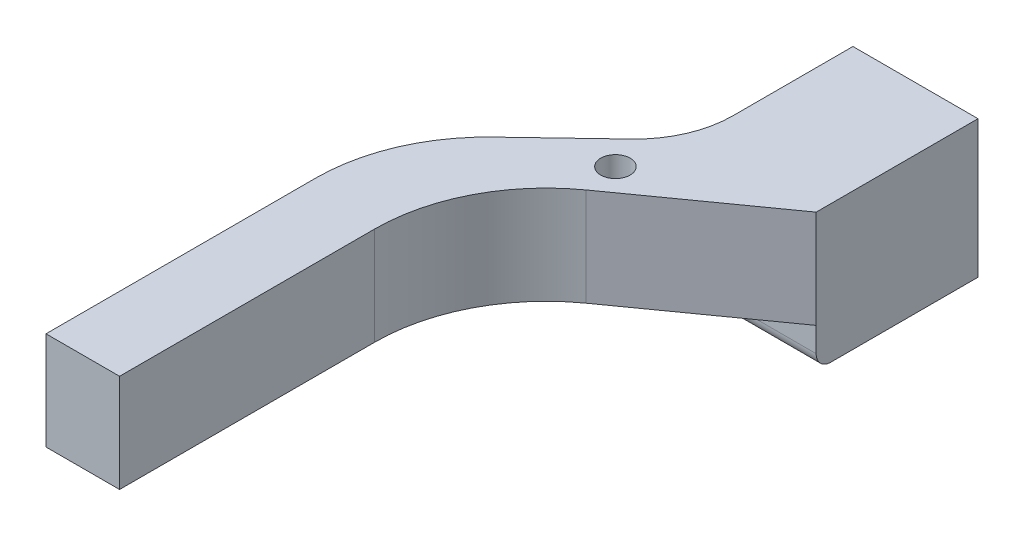
ISO-10303-21;
HEADER;
FILE_DESCRIPTION(('STEP AP214'),'2;1');
FILE_NAME('part.step','',(''),(''),'','','');
FILE_SCHEMA(('AUTOMOTIVE_DESIGN { 1 0 10303 214 1 1 1 1 }'));
ENDSEC;
DATA;
#1=APPLICATION_CONTEXT('core data for automotive mechanical design processes');
#2=APPLICATION_PROTOCOL_DEFINITION('international standard','automotive_design',2000,#1);
#3=PRODUCT_CONTEXT('',#1,'mechanical');
#4=PRODUCT('Part','Part','',(#3));
#5=PRODUCT_RELATED_PRODUCT_CATEGORY('part','',(#4));
#6=PRODUCT_DEFINITION_FORMATION('','',#4);
#7=PRODUCT_DEFINITION_CONTEXT('part definition',#1,'design');
#8=PRODUCT_DEFINITION('design','',#6,#7);
#9=PRODUCT_DEFINITION_SHAPE('','',#8);
#10=(LENGTH_UNIT() NAMED_UNIT(*) SI_UNIT(.MILLI.,.METRE.));
#11=(NAMED_UNIT(*) PLANE_ANGLE_UNIT() SI_UNIT($,.RADIAN.));
#12=(NAMED_UNIT(*) SI_UNIT($,.STERADIAN.) SOLID_ANGLE_UNIT());
#13=UNCERTAINTY_MEASURE_WITH_UNIT(LENGTH_MEASURE(1.E-05),#10,'distance_accuracy_value','');
#14=(GEOMETRIC_REPRESENTATION_CONTEXT(3) GLOBAL_UNCERTAINTY_ASSIGNED_CONTEXT((#13)) GLOBAL_UNIT_ASSIGNED_CONTEXT((#10,
#11,#12)) REPRESENTATION_CONTEXT('',''));
#15=CARTESIAN_POINT('',(0.,0.,0.));
#16=DIRECTION('',(0.,0.,1.));
#17=DIRECTION('',(1.,0.,0.));
#18=AXIS2_PLACEMENT_3D('',#15,#16,#17);
#19=CARTESIAN_POINT('',(81.5691059886915,0.,0.));
#20=DIRECTION('',(0.,0.,-1.));
#21=DIRECTION('',(1.,0.,0.));
#22=AXIS2_PLACEMENT_3D('',#19,#20,#21);
#23=PLANE('',#22);
#24=DIRECTION('',(0.,1.,0.));
#25=VECTOR('',#24,1.);
#26=CARTESIAN_POINT('',(72.3191059886915,-14.,0.));
#27=LINE('',#26,#25);
#28=CARTESIAN_POINT('',(72.3191059886915,-14.,0.));
#29=VERTEX_POINT('',#28);
#30=CARTESIAN_POINT('',(72.3191059886915,14.,0.));
#31=VERTEX_POINT('',#30);
#32=EDGE_CURVE('E240',#29,#31,#27,.T.);
#33=ORIENTED_EDGE('',*,*,#32,.T.);
#34=DIRECTION('',(1.,0.,0.));
#35=VECTOR('',#34,1.);
#36=CARTESIAN_POINT('',(97.8191059886915,14.,0.));
#37=LINE('',#36,#35);
#38=CARTESIAN_POINT('',(97.8191059886915,14.,0.));
#39=VERTEX_POINT('',#38);
#40=EDGE_CURVE('E243',#31,#39,#37,.T.);
#41=ORIENTED_EDGE('',*,*,#40,.T.);
#42=DIRECTION('',(0.,-1.,0.));
#43=VECTOR('',#42,1.);
#44=CARTESIAN_POINT('',(97.8191059886915,-14.,0.));
#45=LINE('',#44,#43);
#46=CARTESIAN_POINT('',(97.8191059886915,-14.,0.));
#47=VERTEX_POINT('',#46);
#48=EDGE_CURVE('E246',#39,#47,#45,.T.);
#49=ORIENTED_EDGE('',*,*,#48,.T.);
#50=DIRECTION('',(-1.,0.,0.));
#51=VECTOR('',#50,1.);
#52=CARTESIAN_POINT('',(97.8191059886915,-14.,0.));
#53=LINE('',#52,#51);
#54=EDGE_CURVE('E249',#47,#29,#53,.T.);
#55=ORIENTED_EDGE('',*,*,#54,.T.);
#56=EDGE_LOOP('',(#33,#41,#49,#55));
#57=FACE_BOUND('',#56,.T.);
#58=DIRECTION('',(-1.,0.,0.));
#59=VECTOR('',#58,1.);
#60=CARTESIAN_POINT('',(87.8191059886915,-11.3,0.));
#61=LINE('',#60,#59);
#62=CARTESIAN_POINT('',(87.8191059886915,-11.3,0.));
#63=VERTEX_POINT('',#62);
#64=CARTESIAN_POINT('',(75.3191059886915,-11.3,0.));
#65=VERTEX_POINT('',#64);
#66=EDGE_CURVE('E214',#63,#65,#61,.T.);
#67=ORIENTED_EDGE('',*,*,#66,.F.);
#68=DIRECTION('',(0.,-1.,0.));
#69=VECTOR('',#68,1.);
#70=CARTESIAN_POINT('',(87.8191059886915,-11.3,0.));
#71=LINE('',#70,#69);
#72=CARTESIAN_POINT('',(87.8191059886915,11.3,0.));
#73=VERTEX_POINT('',#72);
#74=EDGE_CURVE('E228',#73,#63,#71,.T.);
#75=ORIENTED_EDGE('',*,*,#74,.F.);
#76=DIRECTION('',(1.,0.,0.));
#77=VECTOR('',#76,1.);
#78=CARTESIAN_POINT('',(87.8191059886915,11.3,0.));
#79=LINE('',#78,#77);
#80=CARTESIAN_POINT('',(75.3191059886915,11.3,0.));
#81=VERTEX_POINT('',#80);
#82=EDGE_CURVE('E225',#81,#73,#79,.T.);
#83=ORIENTED_EDGE('',*,*,#82,.F.);
#84=DIRECTION('',(0.,1.,0.));
#85=VECTOR('',#84,1.);
#86=CARTESIAN_POINT('',(75.3191059886915,-11.3,0.));
#87=LINE('',#86,#85);
#88=EDGE_CURVE('E209',#65,#81,#87,.T.);
#89=ORIENTED_EDGE('',*,*,#88,.F.);
#90=EDGE_LOOP('',(#67,#75,#83,#89));
#91=FACE_BOUND('',#90,.T.);
#92=ADVANCED_FACE('F37',(#57,#91),#23,.T.);
#93=CARTESIAN_POINT('',(72.3191059886915,-14.,30.));
#94=DIRECTION('',(1.,0.,0.));
#95=DIRECTION('',(0.,0.,1.));
#96=AXIS2_PLACEMENT_3D('',#93,#94,#95);
#97=PLANE('',#96);
#98=DIRECTION('',(0.,0.,-1.));
#99=VECTOR('',#98,1.);
#100=CARTESIAN_POINT('',(72.3191059886915,14.,30.));
#101=LINE('',#100,#99);
#102=CARTESIAN_POINT('',(72.3191059886915,14.,24.4220901374142));
#103=VERTEX_POINT('',#102);
#104=EDGE_CURVE('E258',#103,#31,#101,.T.);
#105=ORIENTED_EDGE('',*,*,#104,.T.);
#106=ORIENTED_EDGE('',*,*,#32,.F.);
#107=DIRECTION('',(0.,0.,-1.));
#108=VECTOR('',#107,1.);
#109=CARTESIAN_POINT('',(72.3191059886915,-14.,30.));
#110=LINE('',#109,#108);
#111=CARTESIAN_POINT('',(72.3191059886915,-14.,30.));
#112=VERTEX_POINT('',#111);
#113=EDGE_CURVE('E252',#112,#29,#110,.T.);
#114=ORIENTED_EDGE('',*,*,#113,.F.);
#115=CARTESIAN_POINT('',(72.3191059886915,-11.,30.));
#116=DIRECTION('',(-1.,0.,0.));
#117=DIRECTION('',(0.,0.,1.));
#118=AXIS2_PLACEMENT_3D('',#115,#116,#117);
#119=CIRCLE('',#118,3.);
#120=CARTESIAN_POINT('',(72.3191059886915,-11.,33.));
#121=VERTEX_POINT('',#120);
#122=EDGE_CURVE('E262',#121,#112,#119,.F.);
#123=ORIENTED_EDGE('',*,*,#122,.F.);
#124=DIRECTION('',(0.,1.,0.));
#125=VECTOR('',#124,1.);
#126=CARTESIAN_POINT('',(72.3191059886915,14.,33.));
#127=LINE('',#126,#125);
#128=CARTESIAN_POINT('',(72.3191059886915,-6.,33.));
#129=VERTEX_POINT('',#128);
#130=EDGE_CURVE('E201',#121,#129,#127,.T.);
#131=ORIENTED_EDGE('',*,*,#130,.T.);
#132=DIRECTION('',(0.,0.,1.));
#133=VECTOR('',#132,1.);
#134=CARTESIAN_POINT('',(72.3191059886915,-6.,0.));
#135=LINE('',#134,#133);
#136=CARTESIAN_POINT('',(72.3191059886915,-6.,24.4220901374142));
#137=VERTEX_POINT('',#136);
#138=EDGE_CURVE('E290',#137,#129,#135,.T.);
#139=ORIENTED_EDGE('',*,*,#138,.F.);
#140=DIRECTION('',(0.,1.,0.));
#141=VECTOR('',#140,1.);
#142=CARTESIAN_POINT('',(72.3191059886915,-14.,24.4220901374142));
#143=LINE('',#142,#141);
#144=EDGE_CURVE('E292',#103,#137,#143,.F.);
#145=ORIENTED_EDGE('',*,*,#144,.F.);
#146=EDGE_LOOP('',(#105,#106,#114,#123,#131,#139,#145));
#147=FACE_BOUND('',#146,.T.);
#148=ADVANCED_FACE('F298',(#147),#97,.F.);
#149=CARTESIAN_POINT('',(97.8191059886915,14.,30.));
#150=DIRECTION('',(0.,-1.,0.));
#151=DIRECTION('',(0.,0.,-1.));
#152=AXIS2_PLACEMENT_3D('',#149,#150,#151);
#153=PLANE('',#152);
#154=CARTESIAN_POINT('',(69.3191059886915,14.,45.4260665059655));
#155=DIRECTION('',(0.,-1.,0.));
#156=DIRECTION('',(0.,0.,1.));
#157=AXIS2_PLACEMENT_3D('',#154,#155,#156);
#158=CIRCLE('',#157,3.);
#159=CARTESIAN_POINT('',(69.3191059886915,14.,48.4260665059655));
#160=VERTEX_POINT('',#159);
#161=EDGE_CURVE('E318',#160,#160,#158,.T.);
#162=ORIENTED_EDGE('',*,*,#161,.T.);
#163=EDGE_LOOP('',(#162));
#164=FACE_BOUND('',#163,.T.);
#165=DIRECTION('',(0.,0.,-1.));
#166=VECTOR('',#165,1.);
#167=CARTESIAN_POINT('',(40.7845529943458,14.,133.));
#168=LINE('',#167,#166);
#169=CARTESIAN_POINT('',(40.7845529943458,14.,133.));
#170=VERTEX_POINT('',#169);
#171=CARTESIAN_POINT('',(40.7845529943458,14.,78.0113422595251));
#172=VERTEX_POINT('',#171);
#173=EDGE_CURVE('E194',#170,#172,#168,.T.);
#174=ORIENTED_EDGE('',*,*,#173,.F.);
#175=DIRECTION('',(-1.,0.,0.));
#176=VECTOR('',#175,1.);
#177=CARTESIAN_POINT('',(55.7845529943458,14.,133.));
#178=LINE('',#177,#176);
#179=CARTESIAN_POINT('',(55.7845529943458,14.,133.));
#180=VERTEX_POINT('',#179);
#181=EDGE_CURVE('E192',#180,#170,#178,.T.);
#182=ORIENTED_EDGE('',*,*,#181,.F.);
#183=DIRECTION('',(0.,0.,1.));
#184=VECTOR('',#183,1.);
#185=CARTESIAN_POINT('',(55.7845529943458,14.,63.));
#186=LINE('',#185,#184);
#187=CARTESIAN_POINT('',(55.7845529943458,14.,81.0202352893997));
#188=VERTEX_POINT('',#187);
#189=EDGE_CURVE('E173',#188,#180,#186,.T.);
#190=ORIENTED_EDGE('',*,*,#189,.F.);
#191=CARTESIAN_POINT('',(90.7845529943458,14.,81.0202352893997));
#192=DIRECTION('',(0.,1.,0.));
#193=DIRECTION('',(0.,0.,-1.));
#194=AXIS2_PLACEMENT_3D('',#191,#192,#193);
#195=CIRCLE('',#194,35.);
#196=CARTESIAN_POINT('',(70.452293840509,14.,52.5316544595089));
#197=VERTEX_POINT('',#196);
#198=EDGE_CURVE('E284',#197,#188,#195,.T.);
#199=ORIENTED_EDGE('',*,*,#198,.F.);
#200=DIRECTION('',(-0.813959452282594,0.,0.580921690109622));
#201=VECTOR('',#200,1.);
#202=CARTESIAN_POINT('',(97.8191059886915,14.,33.));
#203=LINE('',#202,#201);
#204=CARTESIAN_POINT('',(97.8191059886915,14.,33.));
#205=VERTEX_POINT('',#204);
#206=EDGE_CURVE('E188',#205,#197,#203,.T.);
#207=ORIENTED_EDGE('',*,*,#206,.F.);
#208=DIRECTION('',(0.,0.,-1.));
#209=VECTOR('',#208,1.);
#210=CARTESIAN_POINT('',(97.8191059886915,14.,30.));
#211=LINE('',#210,#209);
#212=EDGE_CURVE('E256',#205,#39,#211,.T.);
#213=ORIENTED_EDGE('',*,*,#212,.T.);
#214=ORIENTED_EDGE('',*,*,#40,.F.);
#215=ORIENTED_EDGE('',*,*,#104,.F.);
#216=CARTESIAN_POINT('',(52.3191059886915,14.,24.4220901374142));
#217=DIRECTION('',(0.,1.,0.));
#218=DIRECTION('',(0.,0.,-1.));
#219=AXIS2_PLACEMENT_3D('',#216,#217,#218);
#220=CIRCLE('',#219,20.);
#221=CARTESIAN_POINT('',(66.1042781596695,14.,38.9123982161438));
#222=VERTEX_POINT('',#221);
#223=EDGE_CURVE('E46',#222,#103,#220,.T.);
#224=ORIENTED_EDGE('',*,*,#223,.F.);
#225=DIRECTION('',(0.724515403936476,0.,-0.689258608548899));
#226=VECTOR('',#225,1.);
#227=CARTESIAN_POINT('',(72.3191059886915,14.,33.));
#228=LINE('',#227,#226);
#229=CARTESIAN_POINT('',(51.6605016951343,14.,52.6533031217484));
#230=VERTEX_POINT('',#229);
#231=EDGE_CURVE('E197',#230,#222,#228,.T.);
#232=ORIENTED_EDGE('',*,*,#231,.F.);
#233=CARTESIAN_POINT('',(75.7845529943458,14.,78.0113422595251));
#234=DIRECTION('',(0.,1.,0.));
#235=DIRECTION('',(0.,0.,-1.));
#236=AXIS2_PLACEMENT_3D('',#233,#234,#235);
#237=CIRCLE('',#236,35.);
#238=EDGE_CURVE('E272',#172,#230,#237,.F.);
#239=ORIENTED_EDGE('',*,*,#238,.F.);
#240=EDGE_LOOP('',(#174,#182,#190,#199,#207,#213,#214,#215,#224,#232,#239));
#241=FACE_BOUND('',#240,.T.);
#242=ADVANCED_FACE('F346',(#164,#241),#153,.F.);
#243=CARTESIAN_POINT('',(97.8191059886915,-14.,30.));
#244=DIRECTION('',(-1.,0.,0.));
#245=DIRECTION('',(0.,0.,-1.));
#246=AXIS2_PLACEMENT_3D('',#243,#244,#245);
#247=PLANE('',#246);
#248=DIRECTION('',(0.,0.,-1.));
#249=VECTOR('',#248,1.);
#250=CARTESIAN_POINT('',(97.8191059886915,-14.,30.));
#251=LINE('',#250,#249);
#252=CARTESIAN_POINT('',(97.8191059886915,-14.,30.));
#253=VERTEX_POINT('',#252);
#254=EDGE_CURVE('E254',#253,#47,#251,.T.);
#255=ORIENTED_EDGE('',*,*,#254,.T.);
#256=ORIENTED_EDGE('',*,*,#48,.F.);
#257=ORIENTED_EDGE('',*,*,#212,.F.);
#258=DIRECTION('',(0.,-1.,0.));
#259=VECTOR('',#258,1.);
#260=CARTESIAN_POINT('',(97.8191059886915,14.,33.));
#261=LINE('',#260,#259);
#262=CARTESIAN_POINT('',(97.8191059886915,-6.,33.));
#263=VERTEX_POINT('',#262);
#264=EDGE_CURVE('E206',#205,#263,#261,.T.);
#265=ORIENTED_EDGE('',*,*,#264,.T.);
#266=CARTESIAN_POINT('',(97.8191059886915,-11.,33.));
#267=VERTEX_POINT('',#266);
#268=EDGE_CURVE('E205',#263,#267,#261,.T.);
#269=ORIENTED_EDGE('',*,*,#268,.T.);
#270=CARTESIAN_POINT('',(97.8191059886915,-11.,30.));
#271=DIRECTION('',(1.,0.,0.));
#272=DIRECTION('',(0.,0.,-1.));
#273=AXIS2_PLACEMENT_3D('',#270,#271,#272);
#274=CIRCLE('',#273,3.);
#275=EDGE_CURVE('E267',#253,#267,#274,.F.);
#276=ORIENTED_EDGE('',*,*,#275,.F.);
#277=EDGE_LOOP('',(#255,#256,#257,#265,#269,#276));
#278=FACE_BOUND('',#277,.T.);
#279=ADVANCED_FACE('F310',(#278),#247,.F.);
#280=CARTESIAN_POINT('',(97.8191059886915,-14.,30.));
#281=DIRECTION('',(0.,1.,0.));
#282=DIRECTION('',(0.,0.,1.));
#283=AXIS2_PLACEMENT_3D('',#280,#281,#282);
#284=PLANE('',#283);
#285=ORIENTED_EDGE('',*,*,#113,.T.);
#286=ORIENTED_EDGE('',*,*,#54,.F.);
#287=ORIENTED_EDGE('',*,*,#254,.F.);
#288=DIRECTION('',(-1.,0.,0.));
#289=VECTOR('',#288,1.);
#290=CARTESIAN_POINT('',(97.8191059886915,-14.,30.));
#291=LINE('',#290,#289);
#292=EDGE_CURVE('E265',#112,#253,#291,.F.);
#293=ORIENTED_EDGE('',*,*,#292,.F.);
#294=EDGE_LOOP('',(#285,#286,#287,#293));
#295=FACE_BOUND('',#294,.T.);
#296=ADVANCED_FACE('F353',(#295),#284,.F.);
#297=CARTESIAN_POINT('',(75.3191059886915,-11.3,30.));
#298=DIRECTION('',(1.,0.,0.));
#299=DIRECTION('',(0.,0.,1.));
#300=AXIS2_PLACEMENT_3D('',#297,#298,#299);
#301=PLANE('',#300);
#302=ORIENTED_EDGE('',*,*,#88,.T.);
#303=DIRECTION('',(0.,0.,-1.));
#304=VECTOR('',#303,1.);
#305=CARTESIAN_POINT('',(75.3191059886915,11.3,30.));
#306=LINE('',#305,#304);
#307=CARTESIAN_POINT('',(75.3191059886915,11.3,30.));
#308=VERTEX_POINT('',#307);
#309=EDGE_CURVE('E238',#308,#81,#306,.T.);
#310=ORIENTED_EDGE('',*,*,#309,.F.);
#311=DIRECTION('',(0.,1.,0.));
#312=VECTOR('',#311,1.);
#313=CARTESIAN_POINT('',(75.3191059886915,-11.3,30.));
#314=LINE('',#313,#312);
#315=CARTESIAN_POINT('',(75.3191059886915,-11.3,30.));
#316=VERTEX_POINT('',#315);
#317=EDGE_CURVE('E210',#316,#308,#314,.T.);
#318=ORIENTED_EDGE('',*,*,#317,.F.);
#319=DIRECTION('',(0.,0.,-1.));
#320=VECTOR('',#319,1.);
#321=CARTESIAN_POINT('',(75.3191059886915,-11.3,30.));
#322=LINE('',#321,#320);
#323=EDGE_CURVE('E222',#316,#65,#322,.T.);
#324=ORIENTED_EDGE('',*,*,#323,.T.);
#325=EDGE_LOOP('',(#302,#310,#318,#324));
#326=FACE_BOUND('',#325,.T.);
#327=ADVANCED_FACE('F351',(#326),#301,.T.);
#328=CARTESIAN_POINT('',(87.8191059886915,11.3,30.));
#329=DIRECTION('',(0.,-1.,0.));
#330=DIRECTION('',(0.,0.,-1.));
#331=AXIS2_PLACEMENT_3D('',#328,#329,#330);
#332=PLANE('',#331);
#333=ORIENTED_EDGE('',*,*,#82,.T.);
#334=DIRECTION('',(0.,0.,-1.));
#335=VECTOR('',#334,1.);
#336=CARTESIAN_POINT('',(87.8191059886915,11.3,30.));
#337=LINE('',#336,#335);
#338=CARTESIAN_POINT('',(87.8191059886915,11.3,30.));
#339=VERTEX_POINT('',#338);
#340=EDGE_CURVE('E236',#339,#73,#337,.T.);
#341=ORIENTED_EDGE('',*,*,#340,.F.);
#342=DIRECTION('',(1.,0.,0.));
#343=VECTOR('',#342,1.);
#344=CARTESIAN_POINT('',(87.8191059886915,11.3,30.));
#345=LINE('',#344,#343);
#346=EDGE_CURVE('E213',#308,#339,#345,.T.);
#347=ORIENTED_EDGE('',*,*,#346,.F.);
#348=ORIENTED_EDGE('',*,*,#309,.T.);
#349=EDGE_LOOP('',(#333,#341,#347,#348));
#350=FACE_BOUND('',#349,.T.);
#351=ADVANCED_FACE('F406',(#350),#332,.T.);
#352=CARTESIAN_POINT('',(87.8191059886915,-11.3,30.));
#353=DIRECTION('',(-1.,0.,0.));
#354=DIRECTION('',(0.,0.,-1.));
#355=AXIS2_PLACEMENT_3D('',#352,#353,#354);
#356=PLANE('',#355);
#357=ORIENTED_EDGE('',*,*,#74,.T.);
#358=DIRECTION('',(0.,0.,-1.));
#359=VECTOR('',#358,1.);
#360=CARTESIAN_POINT('',(87.8191059886915,-11.3,30.));
#361=LINE('',#360,#359);
#362=CARTESIAN_POINT('',(87.8191059886915,-11.3,30.));
#363=VERTEX_POINT('',#362);
#364=EDGE_CURVE('E234',#363,#63,#361,.T.);
#365=ORIENTED_EDGE('',*,*,#364,.F.);
#366=DIRECTION('',(0.,-1.,0.));
#367=VECTOR('',#366,1.);
#368=CARTESIAN_POINT('',(87.8191059886915,-11.3,30.));
#369=LINE('',#368,#367);
#370=EDGE_CURVE('E217',#339,#363,#369,.T.);
#371=ORIENTED_EDGE('',*,*,#370,.F.);
#372=ORIENTED_EDGE('',*,*,#340,.T.);
#373=EDGE_LOOP('',(#357,#365,#371,#372));
#374=FACE_BOUND('',#373,.T.);
#375=ADVANCED_FACE('F403',(#374),#356,.T.);
#376=CARTESIAN_POINT('',(87.8191059886915,-11.3,30.));
#377=DIRECTION('',(0.,1.,0.));
#378=DIRECTION('',(0.,0.,1.));
#379=AXIS2_PLACEMENT_3D('',#376,#377,#378);
#380=PLANE('',#379);
#381=ORIENTED_EDGE('',*,*,#66,.T.);
#382=ORIENTED_EDGE('',*,*,#323,.F.);
#383=DIRECTION('',(-1.,0.,0.));
#384=VECTOR('',#383,1.);
#385=CARTESIAN_POINT('',(87.8191059886915,-11.3,30.));
#386=LINE('',#385,#384);
#387=EDGE_CURVE('E220',#363,#316,#386,.T.);
#388=ORIENTED_EDGE('',*,*,#387,.F.);
#389=ORIENTED_EDGE('',*,*,#364,.T.);
#390=EDGE_LOOP('',(#381,#382,#388,#389));
#391=FACE_BOUND('',#390,.T.);
#392=ADVANCED_FACE('F399',(#391),#380,.T.);
#393=CARTESIAN_POINT('',(81.5691059886915,0.,30.));
#394=DIRECTION('',(0.,0.,-1.));
#395=DIRECTION('',(1.,0.,0.));
#396=AXIS2_PLACEMENT_3D('',#393,#394,#395);
#397=PLANE('',#396);
#398=ORIENTED_EDGE('',*,*,#317,.T.);
#399=ORIENTED_EDGE('',*,*,#346,.T.);
#400=ORIENTED_EDGE('',*,*,#370,.T.);
#401=ORIENTED_EDGE('',*,*,#387,.T.);
#402=EDGE_LOOP('',(#398,#399,#400,#401));
#403=FACE_BOUND('',#402,.T.);
#404=ADVANCED_FACE('F390',(#403),#397,.T.);
#405=CARTESIAN_POINT('',(81.5691059886915,0.,33.));
#406=DIRECTION('',(0.,0.,-1.));
#407=DIRECTION('',(1.,0.,0.));
#408=AXIS2_PLACEMENT_3D('',#405,#406,#407);
#409=PLANE('',#408);
#410=ORIENTED_EDGE('',*,*,#268,.F.);
#411=DIRECTION('',(1.,0.,0.));
#412=VECTOR('',#411,1.);
#413=CARTESIAN_POINT('',(72.3191059886915,-6.,33.));
#414=LINE('',#413,#412);
#415=EDGE_CURVE('E200',#129,#263,#414,.T.);
#416=ORIENTED_EDGE('',*,*,#415,.F.);
#417=ORIENTED_EDGE('',*,*,#130,.F.);
#418=DIRECTION('',(-1.,0.,0.));
#419=VECTOR('',#418,1.);
#420=CARTESIAN_POINT('',(81.5691059886915,-11.,33.));
#421=LINE('',#420,#419);
#422=EDGE_CURVE('E260',#267,#121,#421,.T.);
#423=ORIENTED_EDGE('',*,*,#422,.F.);
#424=EDGE_LOOP('',(#410,#416,#417,#423));
#425=FACE_BOUND('',#424,.T.);
#426=ADVANCED_FACE('F306',(#425),#409,.F.);
#427=CARTESIAN_POINT('',(72.3191059886915,-6.,33.));
#428=DIRECTION('',(-0.689258608548899,0.,-0.724515403936476));
#429=DIRECTION('',(0.724515403936476,0.,-0.689258608548899));
#430=AXIS2_PLACEMENT_3D('',#427,#428,#429);
#431=PLANE('',#430);
#432=DIRECTION('',(0.724515403936476,0.,-0.689258608548899));
#433=VECTOR('',#432,1.);
#434=CARTESIAN_POINT('',(72.3191059886915,-6.,33.));
#435=LINE('',#434,#433);
#436=CARTESIAN_POINT('',(51.6605016951343,-6.,52.6533031217484));
#437=VERTEX_POINT('',#436);
#438=CARTESIAN_POINT('',(66.1042781596695,-6.,38.9123982161438));
#439=VERTEX_POINT('',#438);
#440=EDGE_CURVE('E178',#437,#439,#435,.T.);
#441=ORIENTED_EDGE('',*,*,#440,.F.);
#442=DIRECTION('',(0.,1.,0.));
#443=VECTOR('',#442,1.);
#444=CARTESIAN_POINT('',(51.6605016951343,-6.,52.6533031217484));
#445=LINE('',#444,#443);
#446=EDGE_CURVE('E275',#230,#437,#445,.F.);
#447=ORIENTED_EDGE('',*,*,#446,.F.);
#448=ORIENTED_EDGE('',*,*,#231,.T.);
#449=DIRECTION('',(0.,1.,0.));
#450=VECTOR('',#449,1.);
#451=CARTESIAN_POINT('',(66.1042781596695,-6.,38.9123982161438));
#452=LINE('',#451,#450);
#453=EDGE_CURVE('E288',#439,#222,#452,.T.);
#454=ORIENTED_EDGE('',*,*,#453,.F.);
#455=EDGE_LOOP('',(#441,#447,#448,#454));
#456=FACE_BOUND('',#455,.T.);
#457=ADVANCED_FACE('F378',(#456),#431,.T.);
#458=CARTESIAN_POINT('',(40.7845529943458,-6.,133.));
#459=DIRECTION('',(-1.,0.,0.));
#460=DIRECTION('',(0.,0.,-1.));
#461=AXIS2_PLACEMENT_3D('',#458,#459,#460);
#462=PLANE('',#461);
#463=DIRECTION('',(0.,0.,-1.));
#464=VECTOR('',#463,1.);
#465=CARTESIAN_POINT('',(40.7845529943458,-6.,133.));
#466=LINE('',#465,#464);
#467=CARTESIAN_POINT('',(40.7845529943458,-6.,133.));
#468=VERTEX_POINT('',#467);
#469=CARTESIAN_POINT('',(40.7845529943458,-6.,78.0113422595251));
#470=VERTEX_POINT('',#469);
#471=EDGE_CURVE('E182',#468,#470,#466,.T.);
#472=ORIENTED_EDGE('',*,*,#471,.F.);
#473=DIRECTION('',(0.,1.,0.));
#474=VECTOR('',#473,1.);
#475=CARTESIAN_POINT('',(40.7845529943458,-6.,133.));
#476=LINE('',#475,#474);
#477=EDGE_CURVE('E177',#468,#170,#476,.T.);
#478=ORIENTED_EDGE('',*,*,#477,.T.);
#479=ORIENTED_EDGE('',*,*,#173,.T.);
#480=DIRECTION('',(0.,1.,0.));
#481=VECTOR('',#480,1.);
#482=CARTESIAN_POINT('',(40.7845529943458,-6.,78.0113422595251));
#483=LINE('',#482,#481);
#484=EDGE_CURVE('E270',#470,#172,#483,.T.);
#485=ORIENTED_EDGE('',*,*,#484,.F.);
#486=EDGE_LOOP('',(#472,#478,#479,#485));
#487=FACE_BOUND('',#486,.T.);
#488=ADVANCED_FACE('F375',(#487),#462,.T.);
#489=CARTESIAN_POINT('',(55.7845529943458,-6.,133.));
#490=DIRECTION('',(0.,0.,1.));
#491=DIRECTION('',(-1.,0.,0.));
#492=AXIS2_PLACEMENT_3D('',#489,#490,#491);
#493=PLANE('',#492);
#494=ORIENTED_EDGE('',*,*,#181,.T.);
#495=ORIENTED_EDGE('',*,*,#477,.F.);
#496=DIRECTION('',(-1.,0.,0.));
#497=VECTOR('',#496,1.);
#498=CARTESIAN_POINT('',(55.7845529943458,-6.,133.));
#499=LINE('',#498,#497);
#500=CARTESIAN_POINT('',(55.7845529943458,-6.,133.));
#501=VERTEX_POINT('',#500);
#502=EDGE_CURVE('E161',#501,#468,#499,.T.);
#503=ORIENTED_EDGE('',*,*,#502,.F.);
#504=DIRECTION('',(0.,1.,0.));
#505=VECTOR('',#504,1.);
#506=CARTESIAN_POINT('',(55.7845529943458,-6.,133.));
#507=LINE('',#506,#505);
#508=EDGE_CURVE('E170',#501,#180,#507,.T.);
#509=ORIENTED_EDGE('',*,*,#508,.T.);
#510=EDGE_LOOP('',(#494,#495,#503,#509));
#511=FACE_BOUND('',#510,.T.);
#512=ADVANCED_FACE('F180',(#511),#493,.T.);
#513=CARTESIAN_POINT('',(55.7845529943458,-6.,63.));
#514=DIRECTION('',(1.,0.,0.));
#515=DIRECTION('',(0.,0.,1.));
#516=AXIS2_PLACEMENT_3D('',#513,#514,#515);
#517=PLANE('',#516);
#518=ORIENTED_EDGE('',*,*,#189,.T.);
#519=ORIENTED_EDGE('',*,*,#508,.F.);
#520=DIRECTION('',(0.,0.,1.));
#521=VECTOR('',#520,1.);
#522=CARTESIAN_POINT('',(55.7845529943458,-6.,63.));
#523=LINE('',#522,#521);
#524=CARTESIAN_POINT('',(55.7845529943458,-6.,81.0202352893997));
#525=VERTEX_POINT('',#524);
#526=EDGE_CURVE('E156',#525,#501,#523,.T.);
#527=ORIENTED_EDGE('',*,*,#526,.F.);
#528=DIRECTION('',(0.,1.,0.));
#529=VECTOR('',#528,1.);
#530=CARTESIAN_POINT('',(55.7845529943458,-6.,81.0202352893997));
#531=LINE('',#530,#529);
#532=EDGE_CURVE('E282',#188,#525,#531,.F.);
#533=ORIENTED_EDGE('',*,*,#532,.F.);
#534=EDGE_LOOP('',(#518,#519,#527,#533));
#535=FACE_BOUND('',#534,.T.);
#536=ADVANCED_FACE('F171',(#535),#517,.T.);
#537=CARTESIAN_POINT('',(97.8191059886915,-6.,33.));
#538=DIRECTION('',(0.580921690109622,0.,0.813959452282594));
#539=DIRECTION('',(-0.813959452282594,0.,0.580921690109622));
#540=AXIS2_PLACEMENT_3D('',#537,#538,#539);
#541=PLANE('',#540);
#542=DIRECTION('',(-0.813959452282594,0.,0.580921690109622));
#543=VECTOR('',#542,1.);
#544=CARTESIAN_POINT('',(97.8191059886915,-6.,33.));
#545=LINE('',#544,#543);
#546=CARTESIAN_POINT('',(70.452293840509,-6.,52.5316544595089));
#547=VERTEX_POINT('',#546);
#548=EDGE_CURVE('E167',#263,#547,#545,.T.);
#549=ORIENTED_EDGE('',*,*,#548,.F.);
#550=ORIENTED_EDGE('',*,*,#264,.F.);
#551=ORIENTED_EDGE('',*,*,#206,.T.);
#552=DIRECTION('',(0.,1.,0.));
#553=VECTOR('',#552,1.);
#554=CARTESIAN_POINT('',(70.452293840509,14.,52.5316544595089));
#555=LINE('',#554,#553);
#556=EDGE_CURVE('E280',#547,#197,#555,.T.);
#557=ORIENTED_EDGE('',*,*,#556,.F.);
#558=EDGE_LOOP('',(#549,#550,#551,#557));
#559=FACE_BOUND('',#558,.T.);
#560=ADVANCED_FACE('F314',(#559),#541,.T.);
#561=CARTESIAN_POINT('',(81.5691059886915,-6.,0.));
#562=DIRECTION('',(0.,1.,0.));
#563=DIRECTION('',(0.,0.,1.));
#564=AXIS2_PLACEMENT_3D('',#561,#562,#563);
#565=PLANE('',#564);
#566=CARTESIAN_POINT('',(69.3191059886915,-6.,45.4260665059655));
#567=DIRECTION('',(0.,-1.,0.));
#568=DIRECTION('',(0.,0.,1.));
#569=AXIS2_PLACEMENT_3D('',#566,#567,#568);
#570=CIRCLE('',#569,3.);
#571=CARTESIAN_POINT('',(69.3191059886915,-6.,48.4260665059655));
#572=VERTEX_POINT('',#571);
#573=EDGE_CURVE('E41',#572,#572,#570,.T.);
#574=ORIENTED_EDGE('',*,*,#573,.F.);
#575=EDGE_LOOP('',(#574));
#576=FACE_BOUND('',#575,.T.);
#577=ORIENTED_EDGE('',*,*,#440,.T.);
#578=CARTESIAN_POINT('',(52.3191059886915,-6.,24.4220901374142));
#579=DIRECTION('',(0.,-1.,0.));
#580=DIRECTION('',(0.,0.,1.));
#581=AXIS2_PLACEMENT_3D('',#578,#579,#580);
#582=CIRCLE('',#581,20.);
#583=EDGE_CURVE('E11',#137,#439,#582,.T.);
#584=ORIENTED_EDGE('',*,*,#583,.F.);
#585=ORIENTED_EDGE('',*,*,#138,.T.);
#586=ORIENTED_EDGE('',*,*,#415,.T.);
#587=ORIENTED_EDGE('',*,*,#548,.T.);
#588=CARTESIAN_POINT('',(90.7845529943458,-6.,81.0202352893997));
#589=DIRECTION('',(0.,-1.,0.));
#590=DIRECTION('',(0.,0.,1.));
#591=AXIS2_PLACEMENT_3D('',#588,#589,#590);
#592=CIRCLE('',#591,35.);
#593=EDGE_CURVE('E164',#525,#547,#592,.T.);
#594=ORIENTED_EDGE('',*,*,#593,.F.);
#595=ORIENTED_EDGE('',*,*,#526,.T.);
#596=ORIENTED_EDGE('',*,*,#502,.T.);
#597=ORIENTED_EDGE('',*,*,#471,.T.);
#598=CARTESIAN_POINT('',(75.7845529943458,-6.,78.0113422595251));
#599=DIRECTION('',(0.,-1.,0.));
#600=DIRECTION('',(0.,0.,1.));
#601=AXIS2_PLACEMENT_3D('',#598,#599,#600);
#602=CIRCLE('',#601,35.);
#603=EDGE_CURVE('E278',#437,#470,#602,.F.);
#604=ORIENTED_EDGE('',*,*,#603,.F.);
#605=EDGE_LOOP('',(#577,#584,#585,#586,#587,#594,#595,#596,#597,#604));
#606=FACE_BOUND('',#605,.T.);
#607=ADVANCED_FACE('F158',(#576,#606),#565,.F.);
#608=CARTESIAN_POINT('',(81.5691059886915,-11.,30.));
#609=DIRECTION('',(-1.,0.,0.));
#610=DIRECTION('',(0.,0.,-1.));
#611=AXIS2_PLACEMENT_3D('',#608,#609,#610);
#612=CYLINDRICAL_SURFACE('',#611,3.);
#613=ORIENTED_EDGE('',*,*,#275,.T.);
#614=ORIENTED_EDGE('',*,*,#422,.T.);
#615=ORIENTED_EDGE('',*,*,#122,.T.);
#616=ORIENTED_EDGE('',*,*,#292,.T.);
#617=EDGE_LOOP('',(#613,#614,#615,#616));
#618=FACE_BOUND('',#617,.T.);
#619=ADVANCED_FACE('F328',(#618),#612,.T.);
#620=CARTESIAN_POINT('',(75.7845529943458,-6.,78.0113422595251));
#621=DIRECTION('',(0.,1.,0.));
#622=DIRECTION('',(0.,0.,1.));
#623=AXIS2_PLACEMENT_3D('',#620,#621,#622);
#624=CYLINDRICAL_SURFACE('',#623,35.);
#625=ORIENTED_EDGE('',*,*,#603,.T.);
#626=ORIENTED_EDGE('',*,*,#484,.T.);
#627=ORIENTED_EDGE('',*,*,#238,.T.);
#628=ORIENTED_EDGE('',*,*,#446,.T.);
#629=EDGE_LOOP('',(#625,#626,#627,#628));
#630=FACE_BOUND('',#629,.T.);
#631=ADVANCED_FACE('F334',(#630),#624,.T.);
#632=CARTESIAN_POINT('',(90.7845529943458,-6.,81.0202352893997));
#633=DIRECTION('',(0.,-1.,0.));
#634=DIRECTION('',(0.,0.,-1.));
#635=AXIS2_PLACEMENT_3D('',#632,#633,#634);
#636=CYLINDRICAL_SURFACE('',#635,35.);
#637=ORIENTED_EDGE('',*,*,#593,.T.);
#638=ORIENTED_EDGE('',*,*,#556,.T.);
#639=ORIENTED_EDGE('',*,*,#198,.T.);
#640=ORIENTED_EDGE('',*,*,#532,.T.);
#641=EDGE_LOOP('',(#637,#638,#639,#640));
#642=FACE_BOUND('',#641,.T.);
#643=ADVANCED_FACE('F362',(#642),#636,.F.);
#644=CARTESIAN_POINT('',(52.3191059886915,-6.,24.4220901374142));
#645=DIRECTION('',(0.,1.,0.));
#646=DIRECTION('',(0.,0.,1.));
#647=AXIS2_PLACEMENT_3D('',#644,#645,#646);
#648=CYLINDRICAL_SURFACE('',#647,20.);
#649=ORIENTED_EDGE('',*,*,#583,.T.);
#650=ORIENTED_EDGE('',*,*,#453,.T.);
#651=ORIENTED_EDGE('',*,*,#223,.T.);
#652=ORIENTED_EDGE('',*,*,#144,.T.);
#653=EDGE_LOOP('',(#649,#650,#651,#652));
#654=FACE_BOUND('',#653,.T.);
#655=ADVANCED_FACE('F39',(#654),#648,.F.);
#656=CARTESIAN_POINT('',(69.3191059886915,-16.,45.4260665059655));
#657=DIRECTION('',(0.,1.,0.));
#658=DIRECTION('',(0.,0.,1.));
#659=AXIS2_PLACEMENT_3D('',#656,#657,#658);
#660=CYLINDRICAL_SURFACE('',#659,3.);
#661=ORIENTED_EDGE('',*,*,#161,.F.);
#662=EDGE_LOOP('',(#661));
#663=FACE_BOUND('',#662,.T.);
#664=ORIENTED_EDGE('',*,*,#573,.T.);
#665=EDGE_LOOP('',(#664));
#666=FACE_BOUND('',#665,.T.);
#667=ADVANCED_FACE('F325',(#663,#666),#660,.F.);
#668=CLOSED_SHELL('',(#92,#148,#242,#279,#296,#327,#351,#375,#392,#404,#426,#457,#488,#512,#536,
#560,#607,#619,#631,#643,#655,#667));
#669=MANIFOLD_SOLID_BREP('B2',#668);
#670=ADVANCED_BREP_SHAPE_REPRESENTATION('',(#18,#669),#14);
#671=SHAPE_DEFINITION_REPRESENTATION(#9,#670);
ENDSEC;
END-ISO-10303-21;
